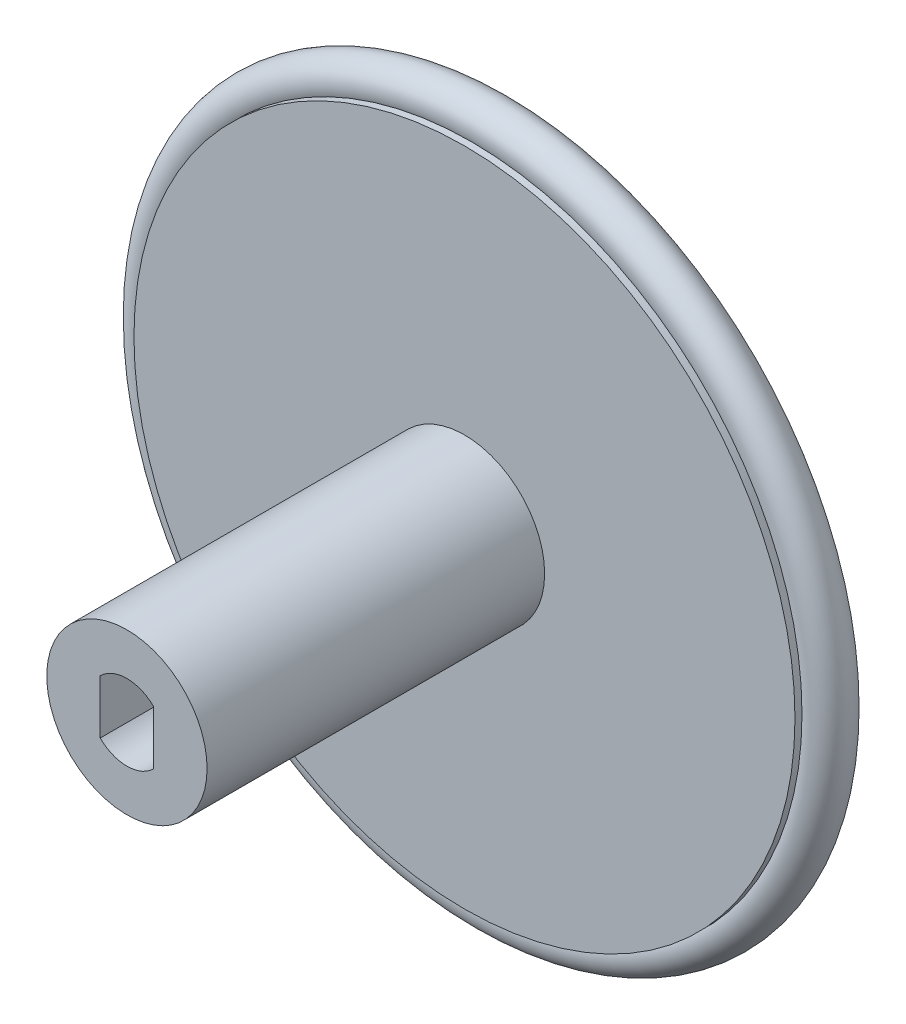
ISO-10303-21;
HEADER;
FILE_DESCRIPTION(('STEP AP214'),'2;1');
FILE_NAME('part.step','',(''),(''),'','','');
FILE_SCHEMA(('AUTOMOTIVE_DESIGN { 1 0 10303 214 1 1 1 1 }'));
ENDSEC;
DATA;
#1=APPLICATION_CONTEXT('core data for automotive mechanical design processes');
#2=APPLICATION_PROTOCOL_DEFINITION('international standard','automotive_design',2000,#1);
#3=PRODUCT_CONTEXT('',#1,'mechanical');
#4=PRODUCT('Part','Part','',(#3));
#5=PRODUCT_RELATED_PRODUCT_CATEGORY('part','',(#4));
#6=PRODUCT_DEFINITION_FORMATION('','',#4);
#7=PRODUCT_DEFINITION_CONTEXT('part definition',#1,'design');
#8=PRODUCT_DEFINITION('design','',#6,#7);
#9=PRODUCT_DEFINITION_SHAPE('','',#8);
#10=(LENGTH_UNIT() NAMED_UNIT(*) SI_UNIT(.MILLI.,.METRE.));
#11=(NAMED_UNIT(*) PLANE_ANGLE_UNIT() SI_UNIT($,.RADIAN.));
#12=(NAMED_UNIT(*) SI_UNIT($,.STERADIAN.) SOLID_ANGLE_UNIT());
#13=UNCERTAINTY_MEASURE_WITH_UNIT(LENGTH_MEASURE(1.E-05),#10,'distance_accuracy_value','');
#14=(GEOMETRIC_REPRESENTATION_CONTEXT(3) GLOBAL_UNCERTAINTY_ASSIGNED_CONTEXT((#13)) GLOBAL_UNIT_ASSIGNED_CONTEXT((#10,
#11,#12)) REPRESENTATION_CONTEXT('',''));
#15=CARTESIAN_POINT('',(0.,0.,0.));
#16=DIRECTION('',(0.,0.,1.));
#17=DIRECTION('',(1.,0.,0.));
#18=AXIS2_PLACEMENT_3D('',#15,#16,#17);
#19=CARTESIAN_POINT('',(0.,0.,0.));
#20=DIRECTION('',(0.,0.,1.));
#21=DIRECTION('',(1.,0.,0.));
#22=AXIS2_PLACEMENT_3D('',#19,#20,#21);
#23=TOROIDAL_SURFACE('',#22,24.039552593733,1.5);
#24=CARTESIAN_POINT('',(25.539552593733,0.,0.));
#25=VERTEX_POINT('',#24);
#26=VERTEX_LOOP('',#25);
#27=FACE_BOUND('',#26,.T.);
#28=ADVANCED_FACE('F44',(#27),#23,.T.);
#29=CLOSED_SHELL('',(#28));
#30=MANIFOLD_SOLID_BREP('B2_NOT_SHOWN',#29);
#31=CARTESIAN_POINT('',(0.,0.,-1.9));
#32=DIRECTION('',(0.,0.,-1.));
#33=DIRECTION('',(-1.,0.,0.));
#34=AXIS2_PLACEMENT_3D('',#31,#32,#33);
#35=PLANE('',#34);
#36=CARTESIAN_POINT('',(0.,0.,-1.89999999999999));
#37=DIRECTION('',(0.,0.,-1.));
#38=DIRECTION('',(-1.,0.,0.));
#39=AXIS2_PLACEMENT_3D('',#36,#37,#38);
#40=CIRCLE('',#39,23.5);
#41=CARTESIAN_POINT('',(-23.5,0.,-1.89999999999999));
#42=VERTEX_POINT('',#41);
#43=EDGE_CURVE('E59',#42,#42,#40,.T.);
#44=ORIENTED_EDGE('',*,*,#43,.T.);
#45=EDGE_LOOP('',(#44));
#46=FACE_BOUND('',#45,.T.);
#47=ADVANCED_FACE('F56',(#46),#35,.T.);
#48=CARTESIAN_POINT('',(0.,0.,-6.22705657946134));
#49=DIRECTION('',(0.,0.,-1.));
#50=DIRECTION('',(-1.,0.,0.));
#51=AXIS2_PLACEMENT_3D('',#48,#49,#50);
#52=CYLINDRICAL_SURFACE('',#51,23.5);
#53=CARTESIAN_POINT('',(0.,0.,-1.39999999999999));
#54=DIRECTION('',(0.,0.,-1.));
#55=DIRECTION('',(-1.,0.,0.));
#56=AXIS2_PLACEMENT_3D('',#53,#54,#55);
#57=CIRCLE('',#56,23.5);
#58=CARTESIAN_POINT('',(-23.5,0.,-1.39999999999999));
#59=VERTEX_POINT('',#58);
#60=EDGE_CURVE('E147',#59,#59,#57,.T.);
#61=ORIENTED_EDGE('',*,*,#60,.T.);
#62=EDGE_LOOP('',(#61));
#63=FACE_BOUND('',#62,.T.);
#64=ORIENTED_EDGE('',*,*,#43,.F.);
#65=EDGE_LOOP('',(#64));
#66=FACE_BOUND('',#65,.T.);
#67=ADVANCED_FACE('F155',(#63,#66),#52,.T.);
#68=CARTESIAN_POINT('',(0.,0.,-1.39999999999999));
#69=DIRECTION('',(0.,0.,-1.));
#70=DIRECTION('',(-1.,0.,0.));
#71=AXIS2_PLACEMENT_3D('',#68,#69,#70);
#72=CONICAL_SURFACE('',#71,23.5,1.22522113490003);
#73=CARTESIAN_POINT('',(0.,0.,-0.499999999999994));
#74=DIRECTION('',(0.,0.,-1.));
#75=DIRECTION('',(-1.,0.,0.));
#76=AXIS2_PLACEMENT_3D('',#73,#74,#75);
#77=CIRCLE('',#76,21.0001538314765);
#78=CARTESIAN_POINT('',(-21.0001538314765,0.,-0.499999999999994));
#79=VERTEX_POINT('',#78);
#80=EDGE_CURVE('E145',#79,#79,#77,.T.);
#81=ORIENTED_EDGE('',*,*,#80,.T.);
#82=EDGE_LOOP('',(#81));
#83=FACE_BOUND('',#82,.T.);
#84=ORIENTED_EDGE('',*,*,#60,.F.);
#85=EDGE_LOOP('',(#84));
#86=FACE_BOUND('',#85,.T.);
#87=ADVANCED_FACE('F157',(#83,#86),#72,.T.);
#88=CARTESIAN_POINT('',(0.,0.,-6.22705657946134));
#89=DIRECTION('',(0.,0.,-1.));
#90=DIRECTION('',(-1.,0.,0.));
#91=AXIS2_PLACEMENT_3D('',#88,#89,#90);
#92=CYLINDRICAL_SURFACE('',#91,21.0001538314765);
#93=CARTESIAN_POINT('',(0.,0.,0.500000000000007));
#94=DIRECTION('',(0.,0.,-1.));
#95=DIRECTION('',(-1.,0.,0.));
#96=AXIS2_PLACEMENT_3D('',#93,#94,#95);
#97=CIRCLE('',#96,21.0001538314765);
#98=CARTESIAN_POINT('',(-21.0001538314765,0.,0.500000000000007));
#99=VERTEX_POINT('',#98);
#100=EDGE_CURVE('E142',#99,#99,#97,.T.);
#101=ORIENTED_EDGE('',*,*,#100,.T.);
#102=EDGE_LOOP('',(#101));
#103=FACE_BOUND('',#102,.T.);
#104=ORIENTED_EDGE('',*,*,#80,.F.);
#105=EDGE_LOOP('',(#104));
#106=FACE_BOUND('',#105,.T.);
#107=ADVANCED_FACE('F162',(#103,#106),#92,.T.);
#108=CARTESIAN_POINT('',(0.,0.,0.500000000000007));
#109=DIRECTION('',(0.,0.,1.));
#110=DIRECTION('',(1.,0.,0.));
#111=AXIS2_PLACEMENT_3D('',#108,#109,#110);
#112=CONICAL_SURFACE('',#111,21.0001538314765,1.22522113490003);
#113=CARTESIAN_POINT('',(0.,0.,1.4));
#114=DIRECTION('',(0.,0.,-1.));
#115=DIRECTION('',(-1.,0.,0.));
#116=AXIS2_PLACEMENT_3D('',#113,#114,#115);
#117=CIRCLE('',#116,23.5);
#118=CARTESIAN_POINT('',(-23.5,0.,1.4));
#119=VERTEX_POINT('',#118);
#120=EDGE_CURVE('E139',#119,#119,#117,.T.);
#121=ORIENTED_EDGE('',*,*,#120,.T.);
#122=EDGE_LOOP('',(#121));
#123=FACE_BOUND('',#122,.T.);
#124=ORIENTED_EDGE('',*,*,#100,.F.);
#125=EDGE_LOOP('',(#124));
#126=FACE_BOUND('',#125,.T.);
#127=ADVANCED_FACE('F168',(#123,#126),#112,.T.);
#128=CARTESIAN_POINT('',(0.,0.,-6.22705657946134));
#129=DIRECTION('',(0.,0.,-1.));
#130=DIRECTION('',(-1.,0.,0.));
#131=AXIS2_PLACEMENT_3D('',#128,#129,#130);
#132=CYLINDRICAL_SURFACE('',#131,23.5);
#133=CARTESIAN_POINT('',(0.,0.,1.9));
#134=DIRECTION('',(0.,0.,-1.));
#135=DIRECTION('',(-1.,0.,0.));
#136=AXIS2_PLACEMENT_3D('',#133,#134,#135);
#137=CIRCLE('',#136,23.5);
#138=CARTESIAN_POINT('',(-23.5,0.,1.9));
#139=VERTEX_POINT('',#138);
#140=EDGE_CURVE('E135',#139,#139,#137,.T.);
#141=ORIENTED_EDGE('',*,*,#140,.T.);
#142=EDGE_LOOP('',(#141));
#143=FACE_BOUND('',#142,.T.);
#144=ORIENTED_EDGE('',*,*,#120,.F.);
#145=EDGE_LOOP('',(#144));
#146=FACE_BOUND('',#145,.T.);
#147=ADVANCED_FACE('F172',(#143,#146),#132,.T.);
#148=CARTESIAN_POINT('',(0.,0.,1.9));
#149=DIRECTION('',(0.,0.,1.));
#150=DIRECTION('',(1.,0.,0.));
#151=AXIS2_PLACEMENT_3D('',#148,#149,#150);
#152=PLANE('',#151);
#153=CARTESIAN_POINT('',(0.,0.,1.9));
#154=DIRECTION('',(0.,0.,1.));
#155=DIRECTION('',(1.,0.,0.));
#156=AXIS2_PLACEMENT_3D('',#153,#154,#155);
#157=CIRCLE('',#156,5.7);
#158=CARTESIAN_POINT('',(5.7,0.,1.9));
#159=VERTEX_POINT('',#158);
#160=EDGE_CURVE('E42',#159,#159,#157,.T.);
#161=ORIENTED_EDGE('',*,*,#160,.F.);
#162=EDGE_LOOP('',(#161));
#163=FACE_BOUND('',#162,.T.);
#164=ORIENTED_EDGE('',*,*,#140,.F.);
#165=EDGE_LOOP('',(#164));
#166=FACE_BOUND('',#165,.T.);
#167=ADVANCED_FACE('F176',(#163,#166),#152,.T.);
#168=CARTESIAN_POINT('',(0.,0.,25.9));
#169=DIRECTION('',(0.,0.,1.));
#170=DIRECTION('',(1.,0.,0.));
#171=AXIS2_PLACEMENT_3D('',#168,#169,#170);
#172=PLANE('',#171);
#173=CARTESIAN_POINT('',(0.,0.,25.9));
#174=DIRECTION('',(0.,0.,1.));
#175=DIRECTION('',(1.,0.,0.));
#176=AXIS2_PLACEMENT_3D('',#173,#174,#175);
#177=CIRCLE('',#176,5.7);
#178=CARTESIAN_POINT('',(5.7,0.,25.9));
#179=VERTEX_POINT('',#178);
#180=EDGE_CURVE('E133',#179,#179,#177,.T.);
#181=ORIENTED_EDGE('',*,*,#180,.T.);
#182=EDGE_LOOP('',(#181));
#183=FACE_BOUND('',#182,.T.);
#184=DIRECTION('',(0.,1.,0.));
#185=VECTOR('',#184,1.);
#186=CARTESIAN_POINT('',(1.9,1.91833260932509,25.9));
#187=LINE('',#186,#185);
#188=CARTESIAN_POINT('',(1.9,-1.91833260932509,25.9));
#189=VERTEX_POINT('',#188);
#190=CARTESIAN_POINT('',(1.9,1.91833260932509,25.9));
#191=VERTEX_POINT('',#190);
#192=EDGE_CURVE('E123',#189,#191,#187,.T.);
#193=ORIENTED_EDGE('',*,*,#192,.F.);
#194=CARTESIAN_POINT('',(0.,0.,25.9));
#195=DIRECTION('',(0.,0.,1.));
#196=DIRECTION('',(1.,0.,0.));
#197=AXIS2_PLACEMENT_3D('',#194,#195,#196);
#198=CIRCLE('',#197,2.70000000000001);
#199=CARTESIAN_POINT('',(-1.9,-1.91833260932509,25.9));
#200=VERTEX_POINT('',#199);
#201=EDGE_CURVE('E120',#200,#189,#198,.T.);
#202=ORIENTED_EDGE('',*,*,#201,.F.);
#203=DIRECTION('',(0.,-1.,0.));
#204=VECTOR('',#203,1.);
#205=CARTESIAN_POINT('',(-1.9,1.91833260932509,25.9));
#206=LINE('',#205,#204);
#207=CARTESIAN_POINT('',(-1.9,1.91833260932509,25.9));
#208=VERTEX_POINT('',#207);
#209=EDGE_CURVE('E105',#208,#200,#206,.T.);
#210=ORIENTED_EDGE('',*,*,#209,.F.);
#211=CARTESIAN_POINT('',(0.,0.,25.9));
#212=DIRECTION('',(0.,0.,1.));
#213=DIRECTION('',(-1.,0.,0.));
#214=AXIS2_PLACEMENT_3D('',#211,#212,#213);
#215=CIRCLE('',#214,2.7);
#216=EDGE_CURVE('E125',#191,#208,#215,.T.);
#217=ORIENTED_EDGE('',*,*,#216,.F.);
#218=EDGE_LOOP('',(#193,#202,#210,#217));
#219=FACE_BOUND('',#218,.T.);
#220=ADVANCED_FACE('F180',(#183,#219),#172,.T.);
#221=CARTESIAN_POINT('',(0.,0.,25.9));
#222=DIRECTION('',(0.,0.,-1.));
#223=DIRECTION('',(-1.,0.,0.));
#224=AXIS2_PLACEMENT_3D('',#221,#222,#223);
#225=CYLINDRICAL_SURFACE('',#224,5.7);
#226=ORIENTED_EDGE('',*,*,#180,.F.);
#227=EDGE_LOOP('',(#226));
#228=FACE_BOUND('',#227,.T.);
#229=ORIENTED_EDGE('',*,*,#160,.T.);
#230=EDGE_LOOP('',(#229));
#231=FACE_BOUND('',#230,.T.);
#232=ADVANCED_FACE('F182',(#228,#231),#225,.T.);
#233=CARTESIAN_POINT('',(0.,0.,25.9));
#234=DIRECTION('',(0.,0.,-1.));
#235=DIRECTION('',(-1.,0.,0.));
#236=AXIS2_PLACEMENT_3D('',#233,#234,#235);
#237=CYLINDRICAL_SURFACE('',#236,2.70000000000001);
#238=CARTESIAN_POINT('',(0.,0.,20.9));
#239=DIRECTION('',(0.,0.,1.));
#240=DIRECTION('',(1.,0.,0.));
#241=AXIS2_PLACEMENT_3D('',#238,#239,#240);
#242=CIRCLE('',#241,2.70000000000001);
#243=CARTESIAN_POINT('',(-1.9,-1.91833260932509,20.9));
#244=VERTEX_POINT('',#243);
#245=CARTESIAN_POINT('',(1.9,-1.91833260932509,20.9));
#246=VERTEX_POINT('',#245);
#247=EDGE_CURVE('E111',#244,#246,#242,.T.);
#248=ORIENTED_EDGE('',*,*,#247,.F.);
#249=DIRECTION('',(0.,0.,-1.));
#250=VECTOR('',#249,1.);
#251=CARTESIAN_POINT('',(-1.9,-1.91833260932509,25.9));
#252=LINE('',#251,#250);
#253=EDGE_CURVE('E99',#200,#244,#252,.T.);
#254=ORIENTED_EDGE('',*,*,#253,.F.);
#255=ORIENTED_EDGE('',*,*,#201,.T.);
#256=DIRECTION('',(0.,0.,-1.));
#257=VECTOR('',#256,1.);
#258=CARTESIAN_POINT('',(1.9,-1.91833260932509,25.9));
#259=LINE('',#258,#257);
#260=EDGE_CURVE('E113',#189,#246,#259,.T.);
#261=ORIENTED_EDGE('',*,*,#260,.T.);
#262=EDGE_LOOP('',(#248,#254,#255,#261));
#263=FACE_BOUND('',#262,.T.);
#264=ADVANCED_FACE('F112',(#263),#237,.F.);
#265=CARTESIAN_POINT('',(1.9,1.91833260932509,25.9));
#266=DIRECTION('',(-1.,0.,0.));
#267=DIRECTION('',(0.,0.,1.));
#268=AXIS2_PLACEMENT_3D('',#265,#266,#267);
#269=PLANE('',#268);
#270=DIRECTION('',(0.,1.,0.));
#271=VECTOR('',#270,1.);
#272=CARTESIAN_POINT('',(1.9,-1.91833260932509,20.9));
#273=LINE('',#272,#271);
#274=CARTESIAN_POINT('',(1.9,1.91833260932509,20.9));
#275=VERTEX_POINT('',#274);
#276=EDGE_CURVE('E71',#246,#275,#273,.T.);
#277=ORIENTED_EDGE('',*,*,#276,.F.);
#278=ORIENTED_EDGE('',*,*,#260,.F.);
#279=ORIENTED_EDGE('',*,*,#192,.T.);
#280=DIRECTION('',(0.,0.,-1.));
#281=VECTOR('',#280,1.);
#282=CARTESIAN_POINT('',(1.9,1.91833260932509,25.9));
#283=LINE('',#282,#281);
#284=EDGE_CURVE('E130',#191,#275,#283,.T.);
#285=ORIENTED_EDGE('',*,*,#284,.T.);
#286=EDGE_LOOP('',(#277,#278,#279,#285));
#287=FACE_BOUND('',#286,.T.);
#288=ADVANCED_FACE('F191',(#287),#269,.T.);
#289=CARTESIAN_POINT('',(0.,0.,25.9));
#290=DIRECTION('',(0.,0.,-1.));
#291=DIRECTION('',(-1.,0.,0.));
#292=AXIS2_PLACEMENT_3D('',#289,#290,#291);
#293=CYLINDRICAL_SURFACE('',#292,2.7);
#294=CARTESIAN_POINT('',(0.,0.,20.9));
#295=DIRECTION('',(0.,0.,1.));
#296=DIRECTION('',(1.,0.,0.));
#297=AXIS2_PLACEMENT_3D('',#294,#295,#296);
#298=CIRCLE('',#297,2.7);
#299=CARTESIAN_POINT('',(-1.9,1.91833260932509,20.9));
#300=VERTEX_POINT('',#299);
#301=EDGE_CURVE('E79',#275,#300,#298,.T.);
#302=ORIENTED_EDGE('',*,*,#301,.F.);
#303=ORIENTED_EDGE('',*,*,#284,.F.);
#304=ORIENTED_EDGE('',*,*,#216,.T.);
#305=DIRECTION('',(0.,0.,-1.));
#306=VECTOR('',#305,1.);
#307=CARTESIAN_POINT('',(-1.9,1.91833260932509,25.9));
#308=LINE('',#307,#306);
#309=EDGE_CURVE('E108',#208,#300,#308,.T.);
#310=ORIENTED_EDGE('',*,*,#309,.T.);
#311=EDGE_LOOP('',(#302,#303,#304,#310));
#312=FACE_BOUND('',#311,.T.);
#313=ADVANCED_FACE('F194',(#312),#293,.F.);
#314=CARTESIAN_POINT('',(-1.9,1.91833260932509,25.9));
#315=DIRECTION('',(1.,0.,0.));
#316=DIRECTION('',(0.,0.,-1.));
#317=AXIS2_PLACEMENT_3D('',#314,#315,#316);
#318=PLANE('',#317);
#319=DIRECTION('',(0.,-1.,0.));
#320=VECTOR('',#319,1.);
#321=CARTESIAN_POINT('',(-1.9,1.91833260932509,20.9));
#322=LINE('',#321,#320);
#323=EDGE_CURVE('E103',#300,#244,#322,.T.);
#324=ORIENTED_EDGE('',*,*,#323,.F.);
#325=ORIENTED_EDGE('',*,*,#309,.F.);
#326=ORIENTED_EDGE('',*,*,#209,.T.);
#327=ORIENTED_EDGE('',*,*,#253,.T.);
#328=EDGE_LOOP('',(#324,#325,#326,#327));
#329=FACE_BOUND('',#328,.T.);
#330=ADVANCED_FACE('F101',(#329),#318,.T.);
#331=CARTESIAN_POINT('',(0.,0.,20.9));
#332=DIRECTION('',(0.,0.,1.));
#333=DIRECTION('',(1.,0.,0.));
#334=AXIS2_PLACEMENT_3D('',#331,#332,#333);
#335=PLANE('',#334);
#336=ORIENTED_EDGE('',*,*,#301,.T.);
#337=ORIENTED_EDGE('',*,*,#323,.T.);
#338=ORIENTED_EDGE('',*,*,#247,.T.);
#339=ORIENTED_EDGE('',*,*,#276,.T.);
#340=EDGE_LOOP('',(#336,#337,#338,#339));
#341=FACE_BOUND('',#340,.T.);
#342=ADVANCED_FACE('F116',(#341),#335,.T.);
#343=CLOSED_SHELL('',(#47,#67,#87,#107,#127,#147,#167,#220,#232,#264,#288,#313,#330,#342));
#344=MANIFOLD_SOLID_BREP('B6',#343);
#345=ADVANCED_BREP_SHAPE_REPRESENTATION('',(#18,#30,#344),#14);
#346=SHAPE_DEFINITION_REPRESENTATION(#9,#345);
ENDSEC;
END-ISO-10303-21;
